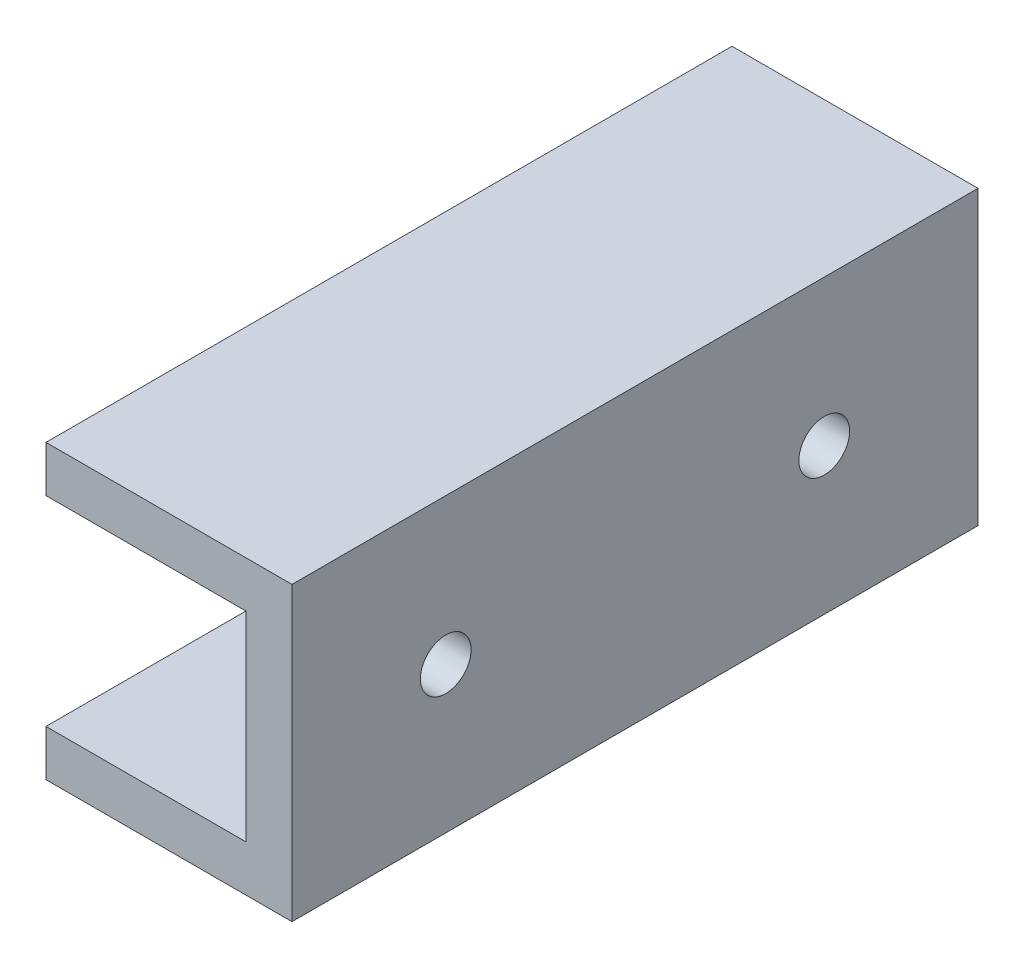
ISO-10303-21;
HEADER;
FILE_DESCRIPTION(('STEP AP214'),'2;1');
FILE_NAME('part.step','',(''),(''),'','','');
FILE_SCHEMA(('AUTOMOTIVE_DESIGN { 1 0 10303 214 1 1 1 1 }'));
ENDSEC;
DATA;
#1=APPLICATION_CONTEXT('core data for automotive mechanical design processes');
#2=APPLICATION_PROTOCOL_DEFINITION('international standard','automotive_design',2000,#1);
#3=PRODUCT_CONTEXT('',#1,'mechanical');
#4=PRODUCT('Part','Part','',(#3));
#5=PRODUCT_RELATED_PRODUCT_CATEGORY('part','',(#4));
#6=PRODUCT_DEFINITION_FORMATION('','',#4);
#7=PRODUCT_DEFINITION_CONTEXT('part definition',#1,'design');
#8=PRODUCT_DEFINITION('design','',#6,#7);
#9=PRODUCT_DEFINITION_SHAPE('','',#8);
#10=(LENGTH_UNIT() NAMED_UNIT(*) SI_UNIT(.MILLI.,.METRE.));
#11=(NAMED_UNIT(*) PLANE_ANGLE_UNIT() SI_UNIT($,.RADIAN.));
#12=(NAMED_UNIT(*) SI_UNIT($,.STERADIAN.) SOLID_ANGLE_UNIT());
#13=UNCERTAINTY_MEASURE_WITH_UNIT(LENGTH_MEASURE(1.E-05),#10,'distance_accuracy_value','');
#14=(GEOMETRIC_REPRESENTATION_CONTEXT(3) GLOBAL_UNCERTAINTY_ASSIGNED_CONTEXT((#13)) GLOBAL_UNIT_ASSIGNED_CONTEXT((#10,
#11,#12)) REPRESENTATION_CONTEXT('',''));
#15=CARTESIAN_POINT('',(0.,0.,0.));
#16=DIRECTION('',(0.,0.,1.));
#17=DIRECTION('',(1.,0.,0.));
#18=AXIS2_PLACEMENT_3D('',#15,#16,#17);
#19=CARTESIAN_POINT('',(0.,0.,44.62));
#20=DIRECTION('',(0.,0.,1.));
#21=DIRECTION('',(1.,0.,0.));
#22=AXIS2_PLACEMENT_3D('',#19,#20,#21);
#23=PLANE('',#22);
#24=DIRECTION('',(-1.,0.,0.));
#25=VECTOR('',#24,1.);
#26=CARTESIAN_POINT('',(0.,16.,44.62));
#27=LINE('',#26,#25);
#28=CARTESIAN_POINT('',(16.,16.,44.62));
#29=VERTEX_POINT('',#28);
#30=CARTESIAN_POINT('',(0.,16.,44.62));
#31=VERTEX_POINT('',#30);
#32=EDGE_CURVE('E138',#29,#31,#27,.T.);
#33=ORIENTED_EDGE('',*,*,#32,.T.);
#34=DIRECTION('',(0.,-1.,0.));
#35=VECTOR('',#34,1.);
#36=CARTESIAN_POINT('',(0.,0.,44.62));
#37=LINE('',#36,#35);
#38=CARTESIAN_POINT('',(0.,13.,44.62));
#39=VERTEX_POINT('',#38);
#40=EDGE_CURVE('E128',#31,#39,#37,.T.);
#41=ORIENTED_EDGE('',*,*,#40,.T.);
#42=DIRECTION('',(-1.,0.,0.));
#43=VECTOR('',#42,1.);
#44=CARTESIAN_POINT('',(0.,13.,44.62));
#45=LINE('',#44,#43);
#46=CARTESIAN_POINT('',(13.,13.,44.62));
#47=VERTEX_POINT('',#46);
#48=EDGE_CURVE('E131',#47,#39,#45,.T.);
#49=ORIENTED_EDGE('',*,*,#48,.F.);
#50=DIRECTION('',(0.,1.,0.));
#51=VECTOR('',#50,1.);
#52=CARTESIAN_POINT('',(13.,0.,44.62));
#53=LINE('',#52,#51);
#54=CARTESIAN_POINT('',(13.,0.,44.62));
#55=VERTEX_POINT('',#54);
#56=EDGE_CURVE('E143',#55,#47,#53,.T.);
#57=ORIENTED_EDGE('',*,*,#56,.F.);
#58=DIRECTION('',(1.,0.,0.));
#59=VECTOR('',#58,1.);
#60=CARTESIAN_POINT('',(0.,0.,44.62));
#61=LINE('',#60,#59);
#62=CARTESIAN_POINT('',(0.,0.,44.62));
#63=VERTEX_POINT('',#62);
#64=EDGE_CURVE('E145',#63,#55,#61,.T.);
#65=ORIENTED_EDGE('',*,*,#64,.F.);
#66=CARTESIAN_POINT('',(0.,-3.,44.62));
#67=VERTEX_POINT('',#66);
#68=EDGE_CURVE('E141',#63,#67,#37,.T.);
#69=ORIENTED_EDGE('',*,*,#68,.T.);
#70=DIRECTION('',(1.,0.,0.));
#71=VECTOR('',#70,1.);
#72=CARTESIAN_POINT('',(0.,-3.,44.62));
#73=LINE('',#72,#71);
#74=CARTESIAN_POINT('',(16.,-3.,44.62));
#75=VERTEX_POINT('',#74);
#76=EDGE_CURVE('E164',#67,#75,#73,.T.);
#77=ORIENTED_EDGE('',*,*,#76,.T.);
#78=DIRECTION('',(0.,1.,0.));
#79=VECTOR('',#78,1.);
#80=CARTESIAN_POINT('',(16.,0.,44.62));
#81=LINE('',#80,#79);
#82=EDGE_CURVE('E166',#75,#29,#81,.T.);
#83=ORIENTED_EDGE('',*,*,#82,.T.);
#84=EDGE_LOOP('',(#33,#41,#49,#57,#65,#69,#77,#83));
#85=FACE_BOUND('',#84,.T.);
#86=ADVANCED_FACE('F60',(#85),#23,.T.);
#87=CARTESIAN_POINT('',(0.,0.,0.));
#88=DIRECTION('',(0.,0.,1.));
#89=DIRECTION('',(1.,0.,0.));
#90=AXIS2_PLACEMENT_3D('',#87,#88,#89);
#91=PLANE('',#90);
#92=DIRECTION('',(0.,-1.,0.));
#93=VECTOR('',#92,1.);
#94=CARTESIAN_POINT('',(0.,0.,0.));
#95=LINE('',#94,#93);
#96=CARTESIAN_POINT('',(0.,16.,0.));
#97=VERTEX_POINT('',#96);
#98=CARTESIAN_POINT('',(0.,13.,0.));
#99=VERTEX_POINT('',#98);
#100=EDGE_CURVE('E85',#97,#99,#95,.T.);
#101=ORIENTED_EDGE('',*,*,#100,.F.);
#102=DIRECTION('',(-1.,0.,0.));
#103=VECTOR('',#102,1.);
#104=CARTESIAN_POINT('',(0.,16.,0.));
#105=LINE('',#104,#103);
#106=CARTESIAN_POINT('',(16.,16.,0.));
#107=VERTEX_POINT('',#106);
#108=EDGE_CURVE('E167',#107,#97,#105,.T.);
#109=ORIENTED_EDGE('',*,*,#108,.F.);
#110=DIRECTION('',(0.,1.,0.));
#111=VECTOR('',#110,1.);
#112=CARTESIAN_POINT('',(16.,0.,0.));
#113=LINE('',#112,#111);
#114=CARTESIAN_POINT('',(16.,-3.,0.));
#115=VERTEX_POINT('',#114);
#116=EDGE_CURVE('E171',#115,#107,#113,.T.);
#117=ORIENTED_EDGE('',*,*,#116,.F.);
#118=DIRECTION('',(1.,0.,0.));
#119=VECTOR('',#118,1.);
#120=CARTESIAN_POINT('',(0.,-3.,0.));
#121=LINE('',#120,#119);
#122=CARTESIAN_POINT('',(0.,-3.,0.));
#123=VERTEX_POINT('',#122);
#124=EDGE_CURVE('E163',#123,#115,#121,.T.);
#125=ORIENTED_EDGE('',*,*,#124,.F.);
#126=CARTESIAN_POINT('',(0.,0.,0.));
#127=VERTEX_POINT('',#126);
#128=EDGE_CURVE('E204',#127,#123,#95,.T.);
#129=ORIENTED_EDGE('',*,*,#128,.F.);
#130=DIRECTION('',(1.,0.,0.));
#131=VECTOR('',#130,1.);
#132=CARTESIAN_POINT('',(0.,0.,0.));
#133=LINE('',#132,#131);
#134=CARTESIAN_POINT('',(13.,0.,0.));
#135=VERTEX_POINT('',#134);
#136=EDGE_CURVE('E149',#127,#135,#133,.T.);
#137=ORIENTED_EDGE('',*,*,#136,.T.);
#138=DIRECTION('',(0.,1.,0.));
#139=VECTOR('',#138,1.);
#140=CARTESIAN_POINT('',(13.,0.,0.));
#141=LINE('',#140,#139);
#142=CARTESIAN_POINT('',(13.,13.,0.));
#143=VERTEX_POINT('',#142);
#144=EDGE_CURVE('E152',#135,#143,#141,.T.);
#145=ORIENTED_EDGE('',*,*,#144,.T.);
#146=DIRECTION('',(-1.,0.,0.));
#147=VECTOR('',#146,1.);
#148=CARTESIAN_POINT('',(0.,13.,0.));
#149=LINE('',#148,#147);
#150=EDGE_CURVE('E156',#143,#99,#149,.T.);
#151=ORIENTED_EDGE('',*,*,#150,.T.);
#152=EDGE_LOOP('',(#101,#109,#117,#125,#129,#137,#145,#151));
#153=FACE_BOUND('',#152,.T.);
#154=ADVANCED_FACE('F202',(#153),#91,.F.);
#155=CARTESIAN_POINT('',(0.,-3.,44.62));
#156=DIRECTION('',(0.,1.,0.));
#157=DIRECTION('',(0.,0.,1.));
#158=AXIS2_PLACEMENT_3D('',#155,#156,#157);
#159=PLANE('',#158);
#160=DIRECTION('',(0.,0.,1.));
#161=VECTOR('',#160,1.);
#162=CARTESIAN_POINT('',(0.,-3.,44.62));
#163=LINE('',#162,#161);
#164=EDGE_CURVE('E209',#123,#67,#163,.T.);
#165=ORIENTED_EDGE('',*,*,#164,.F.);
#166=ORIENTED_EDGE('',*,*,#124,.T.);
#167=DIRECTION('',(0.,0.,-1.));
#168=VECTOR('',#167,1.);
#169=CARTESIAN_POINT('',(16.,-3.,44.62));
#170=LINE('',#169,#168);
#171=EDGE_CURVE('E12',#75,#115,#170,.T.);
#172=ORIENTED_EDGE('',*,*,#171,.F.);
#173=ORIENTED_EDGE('',*,*,#76,.F.);
#174=EDGE_LOOP('',(#165,#166,#172,#173));
#175=FACE_BOUND('',#174,.T.);
#176=ADVANCED_FACE('F62',(#175),#159,.F.);
#177=CARTESIAN_POINT('',(0.,16.,44.62));
#178=DIRECTION('',(0.,-1.,0.));
#179=DIRECTION('',(0.,0.,-1.));
#180=AXIS2_PLACEMENT_3D('',#177,#178,#179);
#181=PLANE('',#180);
#182=DIRECTION('',(0.,0.,-1.));
#183=VECTOR('',#182,1.);
#184=CARTESIAN_POINT('',(0.,16.,44.62));
#185=LINE('',#184,#183);
#186=EDGE_CURVE('E187',#31,#97,#185,.T.);
#187=ORIENTED_EDGE('',*,*,#186,.F.);
#188=ORIENTED_EDGE('',*,*,#32,.F.);
#189=DIRECTION('',(0.,0.,-1.));
#190=VECTOR('',#189,1.);
#191=CARTESIAN_POINT('',(16.,16.,44.62));
#192=LINE('',#191,#190);
#193=EDGE_CURVE('E69',#29,#107,#192,.T.);
#194=ORIENTED_EDGE('',*,*,#193,.T.);
#195=ORIENTED_EDGE('',*,*,#108,.T.);
#196=EDGE_LOOP('',(#187,#188,#194,#195));
#197=FACE_BOUND('',#196,.T.);
#198=ADVANCED_FACE('F220',(#197),#181,.F.);
#199=CARTESIAN_POINT('',(16.,0.,44.62));
#200=DIRECTION('',(-1.,0.,0.));
#201=DIRECTION('',(0.,0.,1.));
#202=AXIS2_PLACEMENT_3D('',#199,#200,#201);
#203=PLANE('',#202);
#204=CARTESIAN_POINT('',(16.,6.5,10.));
#205=DIRECTION('',(-1.,0.,0.));
#206=DIRECTION('',(0.,0.,1.));
#207=AXIS2_PLACEMENT_3D('',#204,#205,#206);
#208=CIRCLE('',#207,1.65);
#209=CARTESIAN_POINT('',(16.,6.5,11.65));
#210=VERTEX_POINT('',#209);
#211=EDGE_CURVE('E153',#210,#210,#208,.T.);
#212=ORIENTED_EDGE('',*,*,#211,.T.);
#213=EDGE_LOOP('',(#212));
#214=FACE_BOUND('',#213,.T.);
#215=CARTESIAN_POINT('',(16.,6.5,34.62));
#216=DIRECTION('',(-1.,0.,0.));
#217=DIRECTION('',(0.,0.,1.));
#218=AXIS2_PLACEMENT_3D('',#215,#216,#217);
#219=CIRCLE('',#218,1.64999999999999);
#220=CARTESIAN_POINT('',(16.,6.5,36.27));
#221=VERTEX_POINT('',#220);
#222=EDGE_CURVE('E177',#221,#221,#219,.T.);
#223=ORIENTED_EDGE('',*,*,#222,.T.);
#224=EDGE_LOOP('',(#223));
#225=FACE_BOUND('',#224,.T.);
#226=ORIENTED_EDGE('',*,*,#116,.T.);
#227=ORIENTED_EDGE('',*,*,#193,.F.);
#228=ORIENTED_EDGE('',*,*,#82,.F.);
#229=ORIENTED_EDGE('',*,*,#171,.T.);
#230=EDGE_LOOP('',(#226,#227,#228,#229));
#231=FACE_BOUND('',#230,.T.);
#232=ADVANCED_FACE('F217',(#214,#225,#231),#203,.F.);
#233=CARTESIAN_POINT('',(0.,0.,44.62));
#234=DIRECTION('',(0.,1.,0.));
#235=DIRECTION('',(0.,0.,1.));
#236=AXIS2_PLACEMENT_3D('',#233,#234,#235);
#237=PLANE('',#236);
#238=ORIENTED_EDGE('',*,*,#136,.F.);
#239=DIRECTION('',(0.,0.,-1.));
#240=VECTOR('',#239,1.);
#241=CARTESIAN_POINT('',(0.,0.,44.62));
#242=LINE('',#241,#240);
#243=EDGE_CURVE('E161',#63,#127,#242,.T.);
#244=ORIENTED_EDGE('',*,*,#243,.F.);
#245=ORIENTED_EDGE('',*,*,#64,.T.);
#246=DIRECTION('',(0.,0.,-1.));
#247=VECTOR('',#246,1.);
#248=CARTESIAN_POINT('',(13.,0.,44.62));
#249=LINE('',#248,#247);
#250=EDGE_CURVE('E159',#55,#135,#249,.T.);
#251=ORIENTED_EDGE('',*,*,#250,.T.);
#252=EDGE_LOOP('',(#238,#244,#245,#251));
#253=FACE_BOUND('',#252,.T.);
#254=ADVANCED_FACE('F195',(#253),#237,.T.);
#255=CARTESIAN_POINT('',(13.,0.,44.62));
#256=DIRECTION('',(-1.,0.,0.));
#257=DIRECTION('',(0.,0.,1.));
#258=AXIS2_PLACEMENT_3D('',#255,#256,#257);
#259=PLANE('',#258);
#260=CARTESIAN_POINT('',(13.,6.5,10.));
#261=DIRECTION('',(-1.,0.,0.));
#262=DIRECTION('',(0.,0.,1.));
#263=AXIS2_PLACEMENT_3D('',#260,#261,#262);
#264=CIRCLE('',#263,1.65);
#265=CARTESIAN_POINT('',(13.,6.5,11.65));
#266=VERTEX_POINT('',#265);
#267=EDGE_CURVE('E64',#266,#266,#264,.T.);
#268=ORIENTED_EDGE('',*,*,#267,.F.);
#269=EDGE_LOOP('',(#268));
#270=FACE_BOUND('',#269,.T.);
#271=CARTESIAN_POINT('',(13.,6.5,34.62));
#272=DIRECTION('',(-1.,0.,0.));
#273=DIRECTION('',(0.,0.,1.));
#274=AXIS2_PLACEMENT_3D('',#271,#272,#273);
#275=CIRCLE('',#274,1.64999999999999);
#276=CARTESIAN_POINT('',(13.,6.5,36.27));
#277=VERTEX_POINT('',#276);
#278=EDGE_CURVE('E139',#277,#277,#275,.T.);
#279=ORIENTED_EDGE('',*,*,#278,.F.);
#280=EDGE_LOOP('',(#279));
#281=FACE_BOUND('',#280,.T.);
#282=ORIENTED_EDGE('',*,*,#144,.F.);
#283=ORIENTED_EDGE('',*,*,#250,.F.);
#284=ORIENTED_EDGE('',*,*,#56,.T.);
#285=DIRECTION('',(0.,0.,-1.));
#286=VECTOR('',#285,1.);
#287=CARTESIAN_POINT('',(13.,13.,44.62));
#288=LINE('',#287,#286);
#289=EDGE_CURVE('E77',#47,#143,#288,.T.);
#290=ORIENTED_EDGE('',*,*,#289,.T.);
#291=EDGE_LOOP('',(#282,#283,#284,#290));
#292=FACE_BOUND('',#291,.T.);
#293=ADVANCED_FACE('F199',(#270,#281,#292),#259,.T.);
#294=CARTESIAN_POINT('',(0.,13.,44.62));
#295=DIRECTION('',(0.,-1.,0.));
#296=DIRECTION('',(0.,0.,-1.));
#297=AXIS2_PLACEMENT_3D('',#294,#295,#296);
#298=PLANE('',#297);
#299=ORIENTED_EDGE('',*,*,#150,.F.);
#300=ORIENTED_EDGE('',*,*,#289,.F.);
#301=ORIENTED_EDGE('',*,*,#48,.T.);
#302=DIRECTION('',(0.,0.,-1.));
#303=VECTOR('',#302,1.);
#304=CARTESIAN_POINT('',(0.,13.,44.62));
#305=LINE('',#304,#303);
#306=EDGE_CURVE('E125',#39,#99,#305,.T.);
#307=ORIENTED_EDGE('',*,*,#306,.T.);
#308=EDGE_LOOP('',(#299,#300,#301,#307));
#309=FACE_BOUND('',#308,.T.);
#310=ADVANCED_FACE('F142',(#309),#298,.T.);
#311=CARTESIAN_POINT('',(27.,6.5,34.62));
#312=DIRECTION('',(-1.,0.,0.));
#313=DIRECTION('',(0.,0.,1.));
#314=AXIS2_PLACEMENT_3D('',#311,#312,#313);
#315=CYLINDRICAL_SURFACE('',#314,1.64999999999999);
#316=CARTESIAN_POINT('',(13.,6.5,36.27));
#317=CARTESIAN_POINT('',(13.03125,6.5,36.27));
#318=CARTESIAN_POINT('',(13.0625,6.5,36.27));
#319=CARTESIAN_POINT('',(13.125,6.5,36.27));
#320=CARTESIAN_POINT('',(13.15625,6.5,36.27));
#321=CARTESIAN_POINT('',(13.21875,6.5,36.27));
#322=CARTESIAN_POINT('',(13.25,6.5,36.27));
#323=CARTESIAN_POINT('',(13.3125,6.5,36.27));
#324=CARTESIAN_POINT('',(13.34375,6.5,36.27));
#325=CARTESIAN_POINT('',(13.40625,6.5,36.27));
#326=CARTESIAN_POINT('',(13.4375,6.5,36.27));
#327=CARTESIAN_POINT('',(13.5,6.5,36.27));
#328=CARTESIAN_POINT('',(13.53125,6.5,36.27));
#329=CARTESIAN_POINT('',(13.59375,6.5,36.27));
#330=CARTESIAN_POINT('',(13.625,6.5,36.27));
#331=CARTESIAN_POINT('',(13.6875,6.5,36.27));
#332=CARTESIAN_POINT('',(13.71875,6.5,36.27));
#333=CARTESIAN_POINT('',(13.78125,6.5,36.27));
#334=CARTESIAN_POINT('',(13.8125,6.5,36.27));
#335=CARTESIAN_POINT('',(13.875,6.5,36.27));
#336=CARTESIAN_POINT('',(13.90625,6.5,36.27));
#337=CARTESIAN_POINT('',(13.96875,6.5,36.27));
#338=CARTESIAN_POINT('',(14.,6.5,36.27));
#339=CARTESIAN_POINT('',(14.0625,6.5,36.27));
#340=CARTESIAN_POINT('',(14.09375,6.5,36.27));
#341=CARTESIAN_POINT('',(14.15625,6.5,36.27));
#342=CARTESIAN_POINT('',(14.1875,6.5,36.27));
#343=CARTESIAN_POINT('',(14.25,6.5,36.27));
#344=CARTESIAN_POINT('',(14.28125,6.5,36.27));
#345=CARTESIAN_POINT('',(14.34375,6.5,36.27));
#346=CARTESIAN_POINT('',(14.375,6.5,36.27));
#347=CARTESIAN_POINT('',(14.4375,6.5,36.27));
#348=CARTESIAN_POINT('',(14.46875,6.5,36.27));
#349=CARTESIAN_POINT('',(14.53125,6.5,36.27));
#350=CARTESIAN_POINT('',(14.5625,6.5,36.27));
#351=CARTESIAN_POINT('',(14.625,6.5,36.27));
#352=CARTESIAN_POINT('',(14.65625,6.5,36.27));
#353=CARTESIAN_POINT('',(14.71875,6.5,36.27));
#354=CARTESIAN_POINT('',(14.75,6.5,36.27));
#355=CARTESIAN_POINT('',(14.8125,6.5,36.27));
#356=CARTESIAN_POINT('',(14.84375,6.5,36.27));
#357=CARTESIAN_POINT('',(14.90625,6.5,36.27));
#358=CARTESIAN_POINT('',(14.9375,6.5,36.27));
#359=CARTESIAN_POINT('',(15.,6.5,36.27));
#360=CARTESIAN_POINT('',(15.03125,6.5,36.27));
#361=CARTESIAN_POINT('',(15.09375,6.5,36.27));
#362=CARTESIAN_POINT('',(15.125,6.5,36.27));
#363=CARTESIAN_POINT('',(15.1875,6.5,36.27));
#364=CARTESIAN_POINT('',(15.21875,6.5,36.27));
#365=CARTESIAN_POINT('',(15.28125,6.5,36.27));
#366=CARTESIAN_POINT('',(15.3125,6.5,36.27));
#367=CARTESIAN_POINT('',(15.375,6.5,36.27));
#368=CARTESIAN_POINT('',(15.40625,6.5,36.27));
#369=CARTESIAN_POINT('',(15.46875,6.5,36.27));
#370=CARTESIAN_POINT('',(15.5,6.5,36.27));
#371=CARTESIAN_POINT('',(15.5625,6.5,36.27));
#372=CARTESIAN_POINT('',(15.59375,6.5,36.27));
#373=CARTESIAN_POINT('',(15.65625,6.5,36.27));
#374=CARTESIAN_POINT('',(15.6875,6.5,36.27));
#375=CARTESIAN_POINT('',(15.75,6.5,36.27));
#376=CARTESIAN_POINT('',(15.78125,6.5,36.27));
#377=CARTESIAN_POINT('',(15.84375,6.5,36.27));
#378=CARTESIAN_POINT('',(15.875,6.5,36.27));
#379=CARTESIAN_POINT('',(15.9375,6.5,36.27));
#380=CARTESIAN_POINT('',(15.96875,6.5,36.27));
#381=CARTESIAN_POINT('',(16.,6.5,36.27));
#382=B_SPLINE_CURVE_WITH_KNOTS('',3,(#316,#317,#318,#319,#320,#321,#322,#323,#324,#325,#326,
#327,#328,#329,#330,#331,#332,#333,#334,#335,#336,#337,#338,#339,#340,#341,#342,#343,#344,#345,
#346,#347,#348,#349,#350,#351,#352,#353,#354,#355,#356,#357,#358,#359,#360,#361,#362,#363,#364,
#365,#366,#367,#368,#369,#370,#371,#372,#373,#374,#375,#376,#377,#378,#379,#380,#381),
.UNSPECIFIED.,.F.,.F.,(4,2,2,2,2,2,2,2,2,2,2,2,2,2,2,2,2,2,2,2,2,2,2,2,2,2,2,2,2,2,2,2,4),(0.,
0.0937500000000001,0.1875,0.28125,0.375,0.46875,0.5625,0.656250000000001,0.750000000000001,
0.843749999999999,0.937499999999999,1.03125,1.125,1.21875,1.3125,1.40625,1.5,1.59375,1.6875,
1.78125,1.875,1.96875,2.0625,2.15625,2.25,2.34375,2.4375,2.53125,2.625,2.71875,2.8125,2.90625,
3.),.UNSPECIFIED.);
#383=EDGE_CURVE('BSEAM242',#277,#221,#382,.T.);
#384=ORIENTED_EDGE('',*,*,#278,.T.);
#385=ORIENTED_EDGE('',*,*,#222,.F.);
#386=ORIENTED_EDGE('',*,*,#383,.T.);
#387=ORIENTED_EDGE('',*,*,#383,.F.);
#388=EDGE_LOOP('',(#384,#386,#385,#387));
#389=FACE_BOUND('',#388,.T.);
#390=ADVANCED_FACE('F242',(#389),#315,.F.);
#391=CARTESIAN_POINT('',(27.,6.5,10.));
#392=DIRECTION('',(-1.,0.,0.));
#393=DIRECTION('',(0.,0.,1.));
#394=AXIS2_PLACEMENT_3D('',#391,#392,#393);
#395=CYLINDRICAL_SURFACE('',#394,1.65);
#396=CARTESIAN_POINT('',(13.,6.5,11.65));
#397=CARTESIAN_POINT('',(13.03125,6.5,11.65));
#398=CARTESIAN_POINT('',(13.0625,6.5,11.65));
#399=CARTESIAN_POINT('',(13.125,6.5,11.65));
#400=CARTESIAN_POINT('',(13.15625,6.5,11.65));
#401=CARTESIAN_POINT('',(13.21875,6.5,11.65));
#402=CARTESIAN_POINT('',(13.25,6.5,11.65));
#403=CARTESIAN_POINT('',(13.3125,6.5,11.65));
#404=CARTESIAN_POINT('',(13.34375,6.5,11.65));
#405=CARTESIAN_POINT('',(13.40625,6.5,11.65));
#406=CARTESIAN_POINT('',(13.4375,6.5,11.65));
#407=CARTESIAN_POINT('',(13.5,6.5,11.65));
#408=CARTESIAN_POINT('',(13.53125,6.5,11.65));
#409=CARTESIAN_POINT('',(13.59375,6.5,11.65));
#410=CARTESIAN_POINT('',(13.625,6.5,11.65));
#411=CARTESIAN_POINT('',(13.6875,6.5,11.65));
#412=CARTESIAN_POINT('',(13.71875,6.5,11.65));
#413=CARTESIAN_POINT('',(13.78125,6.5,11.65));
#414=CARTESIAN_POINT('',(13.8125,6.5,11.65));
#415=CARTESIAN_POINT('',(13.875,6.5,11.65));
#416=CARTESIAN_POINT('',(13.90625,6.5,11.65));
#417=CARTESIAN_POINT('',(13.96875,6.5,11.65));
#418=CARTESIAN_POINT('',(14.,6.5,11.65));
#419=CARTESIAN_POINT('',(14.0625,6.5,11.65));
#420=CARTESIAN_POINT('',(14.09375,6.5,11.65));
#421=CARTESIAN_POINT('',(14.15625,6.5,11.65));
#422=CARTESIAN_POINT('',(14.1875,6.5,11.65));
#423=CARTESIAN_POINT('',(14.25,6.5,11.65));
#424=CARTESIAN_POINT('',(14.28125,6.5,11.65));
#425=CARTESIAN_POINT('',(14.34375,6.5,11.65));
#426=CARTESIAN_POINT('',(14.375,6.5,11.65));
#427=CARTESIAN_POINT('',(14.4375,6.5,11.65));
#428=CARTESIAN_POINT('',(14.46875,6.5,11.65));
#429=CARTESIAN_POINT('',(14.53125,6.5,11.65));
#430=CARTESIAN_POINT('',(14.5625,6.5,11.65));
#431=CARTESIAN_POINT('',(14.625,6.5,11.65));
#432=CARTESIAN_POINT('',(14.65625,6.5,11.65));
#433=CARTESIAN_POINT('',(14.71875,6.5,11.65));
#434=CARTESIAN_POINT('',(14.75,6.5,11.65));
#435=CARTESIAN_POINT('',(14.8125,6.5,11.65));
#436=CARTESIAN_POINT('',(14.84375,6.5,11.65));
#437=CARTESIAN_POINT('',(14.90625,6.5,11.65));
#438=CARTESIAN_POINT('',(14.9375,6.5,11.65));
#439=CARTESIAN_POINT('',(15.,6.5,11.65));
#440=CARTESIAN_POINT('',(15.03125,6.5,11.65));
#441=CARTESIAN_POINT('',(15.09375,6.5,11.65));
#442=CARTESIAN_POINT('',(15.125,6.5,11.65));
#443=CARTESIAN_POINT('',(15.1875,6.5,11.65));
#444=CARTESIAN_POINT('',(15.21875,6.5,11.65));
#445=CARTESIAN_POINT('',(15.28125,6.5,11.65));
#446=CARTESIAN_POINT('',(15.3125,6.5,11.65));
#447=CARTESIAN_POINT('',(15.375,6.5,11.65));
#448=CARTESIAN_POINT('',(15.40625,6.5,11.65));
#449=CARTESIAN_POINT('',(15.46875,6.5,11.65));
#450=CARTESIAN_POINT('',(15.5,6.5,11.65));
#451=CARTESIAN_POINT('',(15.5625,6.5,11.65));
#452=CARTESIAN_POINT('',(15.59375,6.5,11.65));
#453=CARTESIAN_POINT('',(15.65625,6.5,11.65));
#454=CARTESIAN_POINT('',(15.6875,6.5,11.65));
#455=CARTESIAN_POINT('',(15.75,6.5,11.65));
#456=CARTESIAN_POINT('',(15.78125,6.5,11.65));
#457=CARTESIAN_POINT('',(15.84375,6.5,11.65));
#458=CARTESIAN_POINT('',(15.875,6.5,11.65));
#459=CARTESIAN_POINT('',(15.9375,6.5,11.65));
#460=CARTESIAN_POINT('',(15.96875,6.5,11.65));
#461=CARTESIAN_POINT('',(16.,6.5,11.65));
#462=B_SPLINE_CURVE_WITH_KNOTS('',3,(#396,#397,#398,#399,#400,#401,#402,#403,#404,#405,#406,
#407,#408,#409,#410,#411,#412,#413,#414,#415,#416,#417,#418,#419,#420,#421,#422,#423,#424,#425,
#426,#427,#428,#429,#430,#431,#432,#433,#434,#435,#436,#437,#438,#439,#440,#441,#442,#443,#444,
#445,#446,#447,#448,#449,#450,#451,#452,#453,#454,#455,#456,#457,#458,#459,#460,#461),
.UNSPECIFIED.,.F.,.F.,(4,2,2,2,2,2,2,2,2,2,2,2,2,2,2,2,2,2,2,2,2,2,2,2,2,2,2,2,2,2,2,2,4),(0.,
0.0937500000000001,0.1875,0.28125,0.375,0.46875,0.5625,0.656250000000001,0.750000000000001,
0.843749999999999,0.937499999999999,1.03125,1.125,1.21875,1.3125,1.40625,1.5,1.59375,1.6875,
1.78125,1.875,1.96875,2.0625,2.15625,2.25,2.34375,2.4375,2.53125,2.625,2.71875,2.8125,2.90625,
3.),.UNSPECIFIED.);
#463=EDGE_CURVE('BSEAM245',#266,#210,#462,.T.);
#464=ORIENTED_EDGE('',*,*,#267,.T.);
#465=ORIENTED_EDGE('',*,*,#211,.F.);
#466=ORIENTED_EDGE('',*,*,#463,.T.);
#467=ORIENTED_EDGE('',*,*,#463,.F.);
#468=EDGE_LOOP('',(#464,#466,#465,#467));
#469=FACE_BOUND('',#468,.T.);
#470=ADVANCED_FACE('F245',(#469),#395,.F.);
#471=CARTESIAN_POINT('',(0.,0.,0.));
#472=DIRECTION('',(-1.,0.,0.));
#473=DIRECTION('',(0.,0.,1.));
#474=AXIS2_PLACEMENT_3D('',#471,#472,#473);
#475=PLANE('',#474);
#476=ORIENTED_EDGE('',*,*,#186,.T.);
#477=ORIENTED_EDGE('',*,*,#100,.T.);
#478=ORIENTED_EDGE('',*,*,#306,.F.);
#479=ORIENTED_EDGE('',*,*,#40,.F.);
#480=EDGE_LOOP('',(#476,#477,#478,#479));
#481=FACE_BOUND('',#480,.T.);
#482=ADVANCED_FACE('F127',(#481),#475,.T.);
#483=ORIENTED_EDGE('',*,*,#164,.T.);
#484=ORIENTED_EDGE('',*,*,#68,.F.);
#485=ORIENTED_EDGE('',*,*,#243,.T.);
#486=ORIENTED_EDGE('',*,*,#128,.T.);
#487=EDGE_LOOP('',(#483,#484,#485,#486));
#488=FACE_BOUND('',#487,.T.);
#489=ADVANCED_FACE('F210',(#488),#475,.T.);
#490=CLOSED_SHELL('',(#86,#154,#176,#198,#232,#254,#293,#310,#390,#470,#482,#489));
#491=MANIFOLD_SOLID_BREP('B2',#490);
#492=ADVANCED_BREP_SHAPE_REPRESENTATION('',(#18,#491),#14);
#493=SHAPE_DEFINITION_REPRESENTATION(#9,#492);
ENDSEC;
END-ISO-10303-21;
